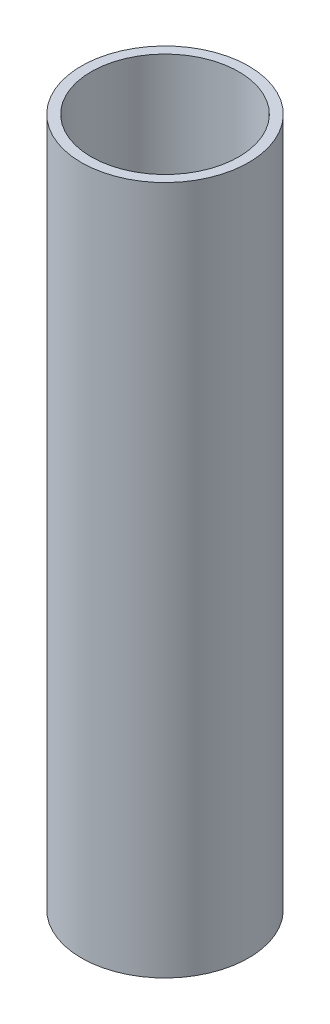
ISO-10303-21;
HEADER;
FILE_DESCRIPTION(('STEP AP214'),'2;1');
FILE_NAME('part.step','',(''),(''),'','','');
FILE_SCHEMA(('AUTOMOTIVE_DESIGN { 1 0 10303 214 1 1 1 1 }'));
ENDSEC;
DATA;
#1=APPLICATION_CONTEXT('core data for automotive mechanical design processes');
#2=APPLICATION_PROTOCOL_DEFINITION('international standard','automotive_design',2000,#1);
#3=PRODUCT_CONTEXT('',#1,'mechanical');
#4=PRODUCT('Part','Part','',(#3));
#5=PRODUCT_RELATED_PRODUCT_CATEGORY('part','',(#4));
#6=PRODUCT_DEFINITION_FORMATION('','',#4);
#7=PRODUCT_DEFINITION_CONTEXT('part definition',#1,'design');
#8=PRODUCT_DEFINITION('design','',#6,#7);
#9=PRODUCT_DEFINITION_SHAPE('','',#8);
#10=(LENGTH_UNIT() NAMED_UNIT(*) SI_UNIT(.MILLI.,.METRE.));
#11=(NAMED_UNIT(*) PLANE_ANGLE_UNIT() SI_UNIT($,.RADIAN.));
#12=(NAMED_UNIT(*) SI_UNIT($,.STERADIAN.) SOLID_ANGLE_UNIT());
#13=UNCERTAINTY_MEASURE_WITH_UNIT(LENGTH_MEASURE(1.E-05),#10,'distance_accuracy_value','');
#14=(GEOMETRIC_REPRESENTATION_CONTEXT(3) GLOBAL_UNCERTAINTY_ASSIGNED_CONTEXT((#13)) GLOBAL_UNIT_ASSIGNED_CONTEXT((#10,
#11,#12)) REPRESENTATION_CONTEXT('',''));
#15=CARTESIAN_POINT('',(0.,0.,0.));
#16=DIRECTION('',(0.,0.,1.));
#17=DIRECTION('',(1.,0.,0.));
#18=AXIS2_PLACEMENT_3D('',#15,#16,#17);
#19=CARTESIAN_POINT('',(0.,70.,0.));
#20=DIRECTION('',(0.,1.,0.));
#21=DIRECTION('',(0.,0.,1.));
#22=AXIS2_PLACEMENT_3D('',#19,#20,#21);
#23=PLANE('',#22);
#24=CARTESIAN_POINT('',(0.,70.,0.));
#25=DIRECTION('',(0.,1.,0.));
#26=DIRECTION('',(0.,0.,1.));
#27=AXIS2_PLACEMENT_3D('',#24,#25,#26);
#28=CIRCLE('',#27,8.5);
#29=CARTESIAN_POINT('',(0.,70.,8.5));
#30=VERTEX_POINT('',#29);
#31=EDGE_CURVE('E10',#30,#30,#28,.T.);
#32=ORIENTED_EDGE('',*,*,#31,.T.);
#33=EDGE_LOOP('',(#32));
#34=FACE_BOUND('',#33,.T.);
#35=CARTESIAN_POINT('',(0.,70.,0.));
#36=DIRECTION('',(0.,1.,0.));
#37=DIRECTION('',(0.,0.,1.));
#38=AXIS2_PLACEMENT_3D('',#35,#36,#37);
#39=CIRCLE('',#38,7.5);
#40=CARTESIAN_POINT('',(0.,70.,7.5));
#41=VERTEX_POINT('',#40);
#42=EDGE_CURVE('E50',#41,#41,#39,.T.);
#43=ORIENTED_EDGE('',*,*,#42,.F.);
#44=EDGE_LOOP('',(#43));
#45=FACE_BOUND('',#44,.T.);
#46=ADVANCED_FACE('F37',(#34,#45),#23,.T.);
#47=CARTESIAN_POINT('',(0.,0.,0.));
#48=DIRECTION('',(0.,1.,0.));
#49=DIRECTION('',(0.,0.,1.));
#50=AXIS2_PLACEMENT_3D('',#47,#48,#49);
#51=PLANE('',#50);
#52=CARTESIAN_POINT('',(0.,0.,0.));
#53=DIRECTION('',(0.,1.,0.));
#54=DIRECTION('',(0.,0.,1.));
#55=AXIS2_PLACEMENT_3D('',#52,#53,#54);
#56=CIRCLE('',#55,8.5);
#57=CARTESIAN_POINT('',(0.,0.,8.5));
#58=VERTEX_POINT('',#57);
#59=EDGE_CURVE('E41',#58,#58,#56,.T.);
#60=ORIENTED_EDGE('',*,*,#59,.F.);
#61=EDGE_LOOP('',(#60));
#62=FACE_BOUND('',#61,.T.);
#63=CARTESIAN_POINT('',(0.,0.,0.));
#64=DIRECTION('',(0.,1.,0.));
#65=DIRECTION('',(0.,0.,1.));
#66=AXIS2_PLACEMENT_3D('',#63,#64,#65);
#67=CIRCLE('',#66,7.5);
#68=CARTESIAN_POINT('',(0.,0.,7.5));
#69=VERTEX_POINT('',#68);
#70=EDGE_CURVE('E52',#69,#69,#67,.T.);
#71=ORIENTED_EDGE('',*,*,#70,.T.);
#72=EDGE_LOOP('',(#71));
#73=FACE_BOUND('',#72,.T.);
#74=ADVANCED_FACE('F64',(#62,#73),#51,.F.);
#75=CARTESIAN_POINT('',(0.,70.,0.));
#76=DIRECTION('',(0.,-1.,0.));
#77=DIRECTION('',(0.,0.,-1.));
#78=AXIS2_PLACEMENT_3D('',#75,#76,#77);
#79=CYLINDRICAL_SURFACE('',#78,8.5);
#80=ORIENTED_EDGE('',*,*,#31,.F.);
#81=EDGE_LOOP('',(#80));
#82=FACE_BOUND('',#81,.T.);
#83=ORIENTED_EDGE('',*,*,#59,.T.);
#84=EDGE_LOOP('',(#83));
#85=FACE_BOUND('',#84,.T.);
#86=ADVANCED_FACE('F39',(#82,#85),#79,.T.);
#87=CARTESIAN_POINT('',(0.,70.,0.));
#88=DIRECTION('',(0.,-1.,0.));
#89=DIRECTION('',(0.,0.,-1.));
#90=AXIS2_PLACEMENT_3D('',#87,#88,#89);
#91=CYLINDRICAL_SURFACE('',#90,7.5);
#92=ORIENTED_EDGE('',*,*,#42,.T.);
#93=EDGE_LOOP('',(#92));
#94=FACE_BOUND('',#93,.T.);
#95=ORIENTED_EDGE('',*,*,#70,.F.);
#96=EDGE_LOOP('',(#95));
#97=FACE_BOUND('',#96,.T.);
#98=ADVANCED_FACE('F60',(#94,#97),#91,.F.);
#99=CLOSED_SHELL('',(#46,#74,#86,#98));
#100=MANIFOLD_SOLID_BREP('B2',#99);
#101=ADVANCED_BREP_SHAPE_REPRESENTATION('',(#18,#100),#14);
#102=SHAPE_DEFINITION_REPRESENTATION(#9,#101);
ENDSEC;
END-ISO-10303-21;
